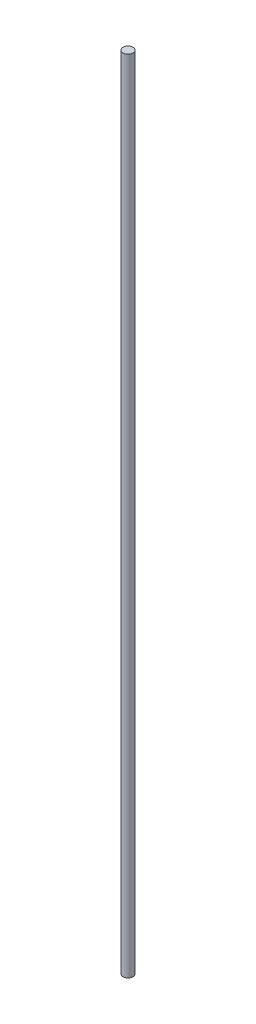
ISO-10303-21;
HEADER;
FILE_DESCRIPTION(('STEP AP214'),'2;1');
FILE_NAME('part.step','',(''),(''),'','','');
FILE_SCHEMA(('AUTOMOTIVE_DESIGN { 1 0 10303 214 1 1 1 1 }'));
ENDSEC;
DATA;
#1=APPLICATION_CONTEXT('core data for automotive mechanical design processes');
#2=APPLICATION_PROTOCOL_DEFINITION('international standard','automotive_design',2000,#1);
#3=PRODUCT_CONTEXT('',#1,'mechanical');
#4=PRODUCT('Part','Part','',(#3));
#5=PRODUCT_RELATED_PRODUCT_CATEGORY('part','',(#4));
#6=PRODUCT_DEFINITION_FORMATION('','',#4);
#7=PRODUCT_DEFINITION_CONTEXT('part definition',#1,'design');
#8=PRODUCT_DEFINITION('design','',#6,#7);
#9=PRODUCT_DEFINITION_SHAPE('','',#8);
#10=(LENGTH_UNIT() NAMED_UNIT(*) SI_UNIT(.MILLI.,.METRE.));
#11=(NAMED_UNIT(*) PLANE_ANGLE_UNIT() SI_UNIT($,.RADIAN.));
#12=(NAMED_UNIT(*) SI_UNIT($,.STERADIAN.) SOLID_ANGLE_UNIT());
#13=UNCERTAINTY_MEASURE_WITH_UNIT(LENGTH_MEASURE(1.E-05),#10,'distance_accuracy_value','');
#14=(GEOMETRIC_REPRESENTATION_CONTEXT(3) GLOBAL_UNCERTAINTY_ASSIGNED_CONTEXT((#13)) GLOBAL_UNIT_ASSIGNED_CONTEXT((#10,
#11,#12)) REPRESENTATION_CONTEXT('',''));
#15=CARTESIAN_POINT('',(0.,0.,0.));
#16=DIRECTION('',(0.,0.,1.));
#17=DIRECTION('',(1.,0.,0.));
#18=AXIS2_PLACEMENT_3D('',#15,#16,#17);
#19=CARTESIAN_POINT('',(0.,250.,0.));
#20=DIRECTION('',(0.,-1.,0.));
#21=DIRECTION('',(0.,0.,-1.));
#22=AXIS2_PLACEMENT_3D('',#19,#20,#21);
#23=CYLINDRICAL_SURFACE('',#22,1.575);
#24=CARTESIAN_POINT('',(0.,250.,0.));
#25=DIRECTION('',(0.,1.,0.));
#26=DIRECTION('',(0.,0.,1.));
#27=AXIS2_PLACEMENT_3D('',#24,#25,#26);
#28=CIRCLE('',#27,1.575);
#29=CARTESIAN_POINT('',(0.,250.,1.575));
#30=VERTEX_POINT('',#29);
#31=EDGE_CURVE('E10',#30,#30,#28,.T.);
#32=ORIENTED_EDGE('',*,*,#31,.F.);
#33=EDGE_LOOP('',(#32));
#34=FACE_BOUND('',#33,.T.);
#35=CARTESIAN_POINT('',(0.,0.,0.));
#36=DIRECTION('',(0.,1.,0.));
#37=DIRECTION('',(0.,0.,1.));
#38=AXIS2_PLACEMENT_3D('',#35,#36,#37);
#39=CIRCLE('',#38,1.575);
#40=CARTESIAN_POINT('',(0.,0.,1.575));
#41=VERTEX_POINT('',#40);
#42=EDGE_CURVE('E36',#41,#41,#39,.T.);
#43=ORIENTED_EDGE('',*,*,#42,.T.);
#44=EDGE_LOOP('',(#43));
#45=FACE_BOUND('',#44,.T.);
#46=ADVANCED_FACE('F33',(#34,#45),#23,.T.);
#47=CARTESIAN_POINT('',(0.,250.,0.));
#48=DIRECTION('',(0.,1.,0.));
#49=DIRECTION('',(0.,0.,1.));
#50=AXIS2_PLACEMENT_3D('',#47,#48,#49);
#51=PLANE('',#50);
#52=ORIENTED_EDGE('',*,*,#31,.T.);
#53=EDGE_LOOP('',(#52));
#54=FACE_BOUND('',#53,.T.);
#55=ADVANCED_FACE('F48',(#54),#51,.T.);
#56=CARTESIAN_POINT('',(0.,0.,0.));
#57=DIRECTION('',(0.,1.,0.));
#58=DIRECTION('',(0.,0.,1.));
#59=AXIS2_PLACEMENT_3D('',#56,#57,#58);
#60=PLANE('',#59);
#61=ORIENTED_EDGE('',*,*,#42,.F.);
#62=EDGE_LOOP('',(#61));
#63=FACE_BOUND('',#62,.T.);
#64=ADVANCED_FACE('F46',(#63),#60,.F.);
#65=CLOSED_SHELL('',(#46,#55,#64));
#66=MANIFOLD_SOLID_BREP('B2',#65);
#67=ADVANCED_BREP_SHAPE_REPRESENTATION('',(#18,#66),#14);
#68=SHAPE_DEFINITION_REPRESENTATION(#9,#67);
ENDSEC;
END-ISO-10303-21;
